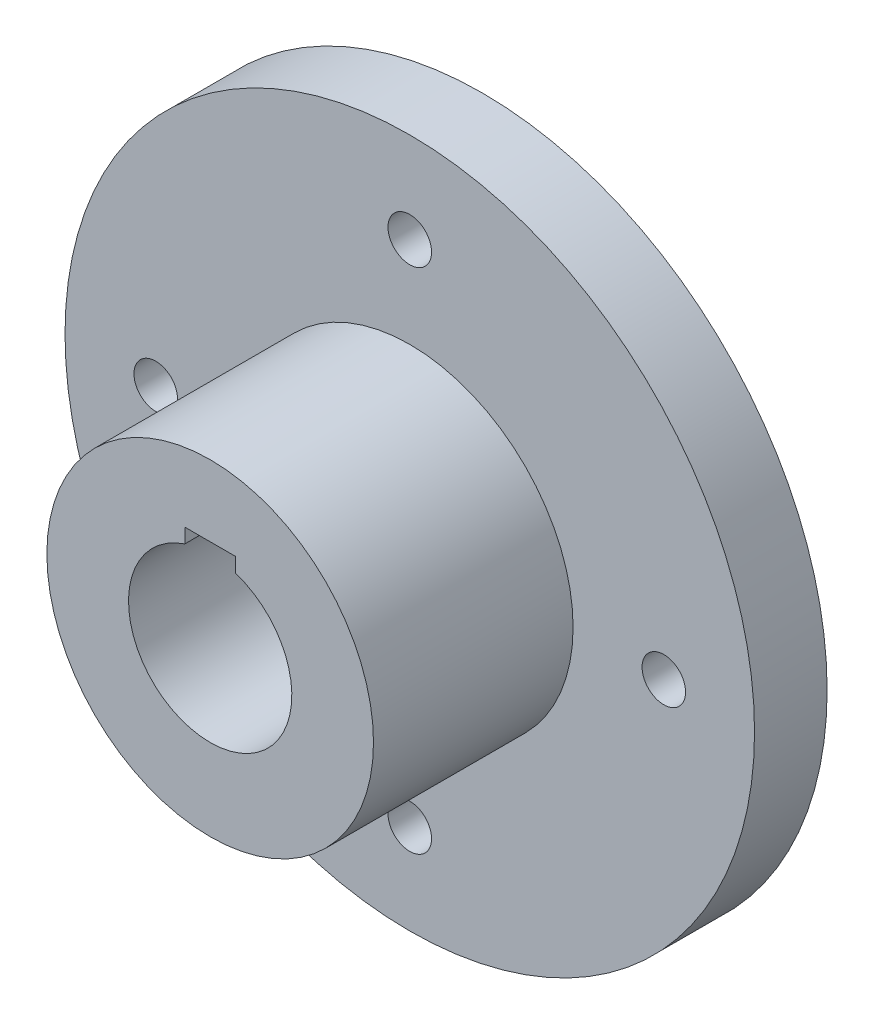
ISO-10303-21;
HEADER;
FILE_DESCRIPTION(('STEP AP214'),'2;1');
FILE_NAME('part.step','',(''),(''),'','','');
FILE_SCHEMA(('AUTOMOTIVE_DESIGN { 1 0 10303 214 1 1 1 1 }'));
ENDSEC;
DATA;
#1=APPLICATION_CONTEXT('core data for automotive mechanical design processes');
#2=APPLICATION_PROTOCOL_DEFINITION('international standard','automotive_design',2000,#1);
#3=PRODUCT_CONTEXT('',#1,'mechanical');
#4=PRODUCT('Part','Part','',(#3));
#5=PRODUCT_RELATED_PRODUCT_CATEGORY('part','',(#4));
#6=PRODUCT_DEFINITION_FORMATION('','',#4);
#7=PRODUCT_DEFINITION_CONTEXT('part definition',#1,'design');
#8=PRODUCT_DEFINITION('design','',#6,#7);
#9=PRODUCT_DEFINITION_SHAPE('','',#8);
#10=(LENGTH_UNIT() NAMED_UNIT(*) SI_UNIT(.MILLI.,.METRE.));
#11=(NAMED_UNIT(*) PLANE_ANGLE_UNIT() SI_UNIT($,.RADIAN.));
#12=(NAMED_UNIT(*) SI_UNIT($,.STERADIAN.) SOLID_ANGLE_UNIT());
#13=UNCERTAINTY_MEASURE_WITH_UNIT(LENGTH_MEASURE(1.E-05),#10,'distance_accuracy_value','');
#14=(GEOMETRIC_REPRESENTATION_CONTEXT(3) GLOBAL_UNCERTAINTY_ASSIGNED_CONTEXT((#13)) GLOBAL_UNIT_ASSIGNED_CONTEXT((#10,
#11,#12)) REPRESENTATION_CONTEXT('',''));
#15=CARTESIAN_POINT('',(0.,0.,0.));
#16=DIRECTION('',(0.,0.,1.));
#17=DIRECTION('',(1.,0.,0.));
#18=AXIS2_PLACEMENT_3D('',#15,#16,#17);
#19=CARTESIAN_POINT('',(0.,0.,20.));
#20=DIRECTION('',(0.,0.,-1.));
#21=DIRECTION('',(-1.,0.,0.));
#22=AXIS2_PLACEMENT_3D('',#19,#20,#21);
#23=CYLINDRICAL_SURFACE('',#22,95.);
#24=CARTESIAN_POINT('',(0.,0.,20.));
#25=DIRECTION('',(0.,0.,1.));
#26=DIRECTION('',(1.,0.,0.));
#27=AXIS2_PLACEMENT_3D('',#24,#25,#26);
#28=CIRCLE('',#27,95.);
#29=CARTESIAN_POINT('',(95.,0.,20.));
#30=VERTEX_POINT('',#29);
#31=EDGE_CURVE('E11',#30,#30,#28,.T.);
#32=ORIENTED_EDGE('',*,*,#31,.F.);
#33=EDGE_LOOP('',(#32));
#34=FACE_BOUND('',#33,.T.);
#35=CARTESIAN_POINT('',(0.,0.,0.));
#36=DIRECTION('',(0.,0.,1.));
#37=DIRECTION('',(1.,0.,0.));
#38=AXIS2_PLACEMENT_3D('',#35,#36,#37);
#39=CIRCLE('',#38,95.);
#40=CARTESIAN_POINT('',(95.,0.,0.));
#41=VERTEX_POINT('',#40);
#42=EDGE_CURVE('E40',#41,#41,#39,.T.);
#43=ORIENTED_EDGE('',*,*,#42,.T.);
#44=EDGE_LOOP('',(#43));
#45=FACE_BOUND('',#44,.T.);
#46=ADVANCED_FACE('F37',(#34,#45),#23,.T.);
#47=CARTESIAN_POINT('',(0.,0.,20.));
#48=DIRECTION('',(0.,0.,1.));
#49=DIRECTION('',(1.,0.,0.));
#50=AXIS2_PLACEMENT_3D('',#47,#48,#49);
#51=PLANE('',#50);
#52=CARTESIAN_POINT('',(0.,0.,20.));
#53=DIRECTION('',(0.,0.,1.));
#54=DIRECTION('',(1.,0.,0.));
#55=AXIS2_PLACEMENT_3D('',#52,#53,#54);
#56=CIRCLE('',#55,45.);
#57=CARTESIAN_POINT('',(45.,0.,20.));
#58=VERTEX_POINT('',#57);
#59=EDGE_CURVE('E112',#58,#58,#56,.T.);
#60=ORIENTED_EDGE('',*,*,#59,.F.);
#61=EDGE_LOOP('',(#60));
#62=FACE_BOUND('',#61,.T.);
#63=CARTESIAN_POINT('',(0.,70.,20.));
#64=DIRECTION('',(0.,0.,-1.));
#65=DIRECTION('',(-1.,0.,0.));
#66=AXIS2_PLACEMENT_3D('',#63,#64,#65);
#67=CIRCLE('',#66,6.);
#68=CARTESIAN_POINT('',(-6.,70.,20.));
#69=VERTEX_POINT('',#68);
#70=EDGE_CURVE('E121',#69,#69,#67,.T.);
#71=ORIENTED_EDGE('',*,*,#70,.T.);
#72=EDGE_LOOP('',(#71));
#73=FACE_BOUND('',#72,.T.);
#74=CARTESIAN_POINT('',(-70.,0.,20.));
#75=DIRECTION('',(0.,0.,-1.));
#76=DIRECTION('',(-1.,0.,0.));
#77=AXIS2_PLACEMENT_3D('',#74,#75,#76);
#78=CIRCLE('',#77,6.);
#79=CARTESIAN_POINT('',(-76.,0.,20.));
#80=VERTEX_POINT('',#79);
#81=EDGE_CURVE('E130',#80,#80,#78,.T.);
#82=ORIENTED_EDGE('',*,*,#81,.T.);
#83=EDGE_LOOP('',(#82));
#84=FACE_BOUND('',#83,.T.);
#85=CARTESIAN_POINT('',(0.,-70.,20.));
#86=DIRECTION('',(0.,0.,-1.));
#87=DIRECTION('',(1.,0.,0.));
#88=AXIS2_PLACEMENT_3D('',#85,#86,#87);
#89=CIRCLE('',#88,6.);
#90=CARTESIAN_POINT('',(6.00000000000001,-70.,20.));
#91=VERTEX_POINT('',#90);
#92=EDGE_CURVE('E136',#91,#91,#89,.T.);
#93=ORIENTED_EDGE('',*,*,#92,.T.);
#94=EDGE_LOOP('',(#93));
#95=FACE_BOUND('',#94,.T.);
#96=CARTESIAN_POINT('',(70.,0.,20.));
#97=DIRECTION('',(0.,0.,-1.));
#98=DIRECTION('',(1.,0.,0.));
#99=AXIS2_PLACEMENT_3D('',#96,#97,#98);
#100=CIRCLE('',#99,6.);
#101=CARTESIAN_POINT('',(76.,0.,20.));
#102=VERTEX_POINT('',#101);
#103=EDGE_CURVE('E118',#102,#102,#100,.T.);
#104=ORIENTED_EDGE('',*,*,#103,.T.);
#105=EDGE_LOOP('',(#104));
#106=FACE_BOUND('',#105,.T.);
#107=ORIENTED_EDGE('',*,*,#31,.T.);
#108=EDGE_LOOP('',(#107));
#109=FACE_BOUND('',#108,.T.);
#110=ADVANCED_FACE('F145',(#62,#73,#84,#95,#106,#109),#51,.T.);
#111=CARTESIAN_POINT('',(0.,0.,0.));
#112=DIRECTION('',(0.,0.,1.));
#113=DIRECTION('',(1.,0.,0.));
#114=AXIS2_PLACEMENT_3D('',#111,#112,#113);
#115=PLANE('',#114);
#116=DIRECTION('',(0.,1.,0.));
#117=VECTOR('',#116,1.);
#118=CARTESIAN_POINT('',(-7.,25.4,0.));
#119=LINE('',#118,#117);
#120=CARTESIAN_POINT('',(-7.,21.3834047803431,0.));
#121=VERTEX_POINT('',#120);
#122=CARTESIAN_POINT('',(-7.,25.4,0.));
#123=VERTEX_POINT('',#122);
#124=EDGE_CURVE('E103',#121,#123,#119,.T.);
#125=ORIENTED_EDGE('',*,*,#124,.F.);
#126=CARTESIAN_POINT('',(0.,0.,0.));
#127=DIRECTION('',(0.,0.,-1.));
#128=DIRECTION('',(-1.,0.,0.));
#129=AXIS2_PLACEMENT_3D('',#126,#127,#128);
#130=CIRCLE('',#129,22.5);
#131=CARTESIAN_POINT('',(7.,21.3834047803431,0.));
#132=VERTEX_POINT('',#131);
#133=EDGE_CURVE('E51',#132,#121,#130,.T.);
#134=ORIENTED_EDGE('',*,*,#133,.F.);
#135=DIRECTION('',(0.,-1.,0.));
#136=VECTOR('',#135,1.);
#137=CARTESIAN_POINT('',(7.,22.5,0.));
#138=LINE('',#137,#136);
#139=CARTESIAN_POINT('',(7.,25.4,0.));
#140=VERTEX_POINT('',#139);
#141=EDGE_CURVE('E107',#140,#132,#138,.T.);
#142=ORIENTED_EDGE('',*,*,#141,.F.);
#143=DIRECTION('',(1.,0.,0.));
#144=VECTOR('',#143,1.);
#145=CARTESIAN_POINT('',(7.,25.4,0.));
#146=LINE('',#145,#144);
#147=EDGE_CURVE('E79',#123,#140,#146,.T.);
#148=ORIENTED_EDGE('',*,*,#147,.F.);
#149=EDGE_LOOP('',(#125,#134,#142,#148));
#150=FACE_BOUND('',#149,.T.);
#151=CARTESIAN_POINT('',(0.,70.,0.));
#152=DIRECTION('',(0.,0.,-1.));
#153=DIRECTION('',(-1.,0.,0.));
#154=AXIS2_PLACEMENT_3D('',#151,#152,#153);
#155=CIRCLE('',#154,6.);
#156=CARTESIAN_POINT('',(-6.,70.,0.));
#157=VERTEX_POINT('',#156);
#158=EDGE_CURVE('E124',#157,#157,#155,.T.);
#159=ORIENTED_EDGE('',*,*,#158,.F.);
#160=EDGE_LOOP('',(#159));
#161=FACE_BOUND('',#160,.T.);
#162=CARTESIAN_POINT('',(-70.,0.,0.));
#163=DIRECTION('',(0.,0.,-1.));
#164=DIRECTION('',(-1.,0.,0.));
#165=AXIS2_PLACEMENT_3D('',#162,#163,#164);
#166=CIRCLE('',#165,6.);
#167=CARTESIAN_POINT('',(-76.,0.,0.));
#168=VERTEX_POINT('',#167);
#169=EDGE_CURVE('E127',#168,#168,#166,.T.);
#170=ORIENTED_EDGE('',*,*,#169,.F.);
#171=EDGE_LOOP('',(#170));
#172=FACE_BOUND('',#171,.T.);
#173=CARTESIAN_POINT('',(0.,-70.,0.));
#174=DIRECTION('',(0.,0.,-1.));
#175=DIRECTION('',(1.,0.,0.));
#176=AXIS2_PLACEMENT_3D('',#173,#174,#175);
#177=CIRCLE('',#176,6.);
#178=CARTESIAN_POINT('',(6.00000000000001,-70.,0.));
#179=VERTEX_POINT('',#178);
#180=EDGE_CURVE('E133',#179,#179,#177,.T.);
#181=ORIENTED_EDGE('',*,*,#180,.F.);
#182=EDGE_LOOP('',(#181));
#183=FACE_BOUND('',#182,.T.);
#184=CARTESIAN_POINT('',(70.,0.,0.));
#185=DIRECTION('',(0.,0.,-1.));
#186=DIRECTION('',(1.,0.,0.));
#187=AXIS2_PLACEMENT_3D('',#184,#185,#186);
#188=CIRCLE('',#187,6.);
#189=CARTESIAN_POINT('',(76.,0.,0.));
#190=VERTEX_POINT('',#189);
#191=EDGE_CURVE('E139',#190,#190,#188,.T.);
#192=ORIENTED_EDGE('',*,*,#191,.F.);
#193=EDGE_LOOP('',(#192));
#194=FACE_BOUND('',#193,.T.);
#195=ORIENTED_EDGE('',*,*,#42,.F.);
#196=EDGE_LOOP('',(#195));
#197=FACE_BOUND('',#196,.T.);
#198=ADVANCED_FACE('F152',(#150,#161,#172,#183,#194,#197),#115,.F.);
#199=CARTESIAN_POINT('',(70.,0.,20.));
#200=DIRECTION('',(0.,0.,-1.));
#201=DIRECTION('',(-1.,0.,0.));
#202=AXIS2_PLACEMENT_3D('',#199,#200,#201);
#203=CYLINDRICAL_SURFACE('',#202,6.);
#204=ORIENTED_EDGE('',*,*,#103,.F.);
#205=EDGE_LOOP('',(#204));
#206=FACE_BOUND('',#205,.T.);
#207=ORIENTED_EDGE('',*,*,#191,.T.);
#208=EDGE_LOOP('',(#207));
#209=FACE_BOUND('',#208,.T.);
#210=ADVANCED_FACE('F148',(#206,#209),#203,.F.);
#211=CARTESIAN_POINT('',(0.,-70.,20.));
#212=DIRECTION('',(0.,0.,-1.));
#213=DIRECTION('',(-1.,0.,0.));
#214=AXIS2_PLACEMENT_3D('',#211,#212,#213);
#215=CYLINDRICAL_SURFACE('',#214,6.);
#216=ORIENTED_EDGE('',*,*,#92,.F.);
#217=EDGE_LOOP('',(#216));
#218=FACE_BOUND('',#217,.T.);
#219=ORIENTED_EDGE('',*,*,#180,.T.);
#220=EDGE_LOOP('',(#219));
#221=FACE_BOUND('',#220,.T.);
#222=ADVANCED_FACE('F151',(#218,#221),#215,.F.);
#223=CARTESIAN_POINT('',(-70.,0.,20.));
#224=DIRECTION('',(0.,0.,-1.));
#225=DIRECTION('',(-1.,0.,0.));
#226=AXIS2_PLACEMENT_3D('',#223,#224,#225);
#227=CYLINDRICAL_SURFACE('',#226,6.);
#228=ORIENTED_EDGE('',*,*,#81,.F.);
#229=EDGE_LOOP('',(#228));
#230=FACE_BOUND('',#229,.T.);
#231=ORIENTED_EDGE('',*,*,#169,.T.);
#232=EDGE_LOOP('',(#231));
#233=FACE_BOUND('',#232,.T.);
#234=ADVANCED_FACE('F177',(#230,#233),#227,.F.);
#235=CARTESIAN_POINT('',(0.,70.,20.));
#236=DIRECTION('',(0.,0.,-1.));
#237=DIRECTION('',(-1.,0.,0.));
#238=AXIS2_PLACEMENT_3D('',#235,#236,#237);
#239=CYLINDRICAL_SURFACE('',#238,6.);
#240=ORIENTED_EDGE('',*,*,#70,.F.);
#241=EDGE_LOOP('',(#240));
#242=FACE_BOUND('',#241,.T.);
#243=ORIENTED_EDGE('',*,*,#158,.T.);
#244=EDGE_LOOP('',(#243));
#245=FACE_BOUND('',#244,.T.);
#246=ADVANCED_FACE('F181',(#242,#245),#239,.F.);
#247=CARTESIAN_POINT('',(0.,0.,75.));
#248=DIRECTION('',(0.,0.,-1.));
#249=DIRECTION('',(-1.,0.,0.));
#250=AXIS2_PLACEMENT_3D('',#247,#248,#249);
#251=CYLINDRICAL_SURFACE('',#250,45.);
#252=CARTESIAN_POINT('',(0.,0.,75.));
#253=DIRECTION('',(0.,0.,1.));
#254=DIRECTION('',(1.,0.,0.));
#255=AXIS2_PLACEMENT_3D('',#252,#253,#254);
#256=CIRCLE('',#255,45.);
#257=CARTESIAN_POINT('',(45.,0.,75.));
#258=VERTEX_POINT('',#257);
#259=EDGE_CURVE('E115',#258,#258,#256,.T.);
#260=ORIENTED_EDGE('',*,*,#259,.F.);
#261=EDGE_LOOP('',(#260));
#262=FACE_BOUND('',#261,.T.);
#263=ORIENTED_EDGE('',*,*,#59,.T.);
#264=EDGE_LOOP('',(#263));
#265=FACE_BOUND('',#264,.T.);
#266=ADVANCED_FACE('F185',(#262,#265),#251,.T.);
#267=CARTESIAN_POINT('',(0.,0.,75.));
#268=DIRECTION('',(0.,0.,1.));
#269=DIRECTION('',(1.,0.,0.));
#270=AXIS2_PLACEMENT_3D('',#267,#268,#269);
#271=PLANE('',#270);
#272=CARTESIAN_POINT('',(0.,0.,75.));
#273=DIRECTION('',(0.,0.,-1.));
#274=DIRECTION('',(-1.,0.,0.));
#275=AXIS2_PLACEMENT_3D('',#272,#273,#274);
#276=CIRCLE('',#275,22.5);
#277=CARTESIAN_POINT('',(7.,21.3834047803431,75.));
#278=VERTEX_POINT('',#277);
#279=CARTESIAN_POINT('',(-7.00000000000001,21.3834047803431,75.));
#280=VERTEX_POINT('',#279);
#281=EDGE_CURVE('E92',#278,#280,#276,.T.);
#282=ORIENTED_EDGE('',*,*,#281,.T.);
#283=DIRECTION('',(0.,1.,0.));
#284=VECTOR('',#283,1.);
#285=CARTESIAN_POINT('',(-7.,22.5,75.));
#286=LINE('',#285,#284);
#287=CARTESIAN_POINT('',(-7.,25.4,75.));
#288=VERTEX_POINT('',#287);
#289=EDGE_CURVE('E98',#280,#288,#286,.T.);
#290=ORIENTED_EDGE('',*,*,#289,.T.);
#291=DIRECTION('',(1.,0.,0.));
#292=VECTOR('',#291,1.);
#293=CARTESIAN_POINT('',(7.,25.4,75.));
#294=LINE('',#293,#292);
#295=CARTESIAN_POINT('',(7.,25.4,75.));
#296=VERTEX_POINT('',#295);
#297=EDGE_CURVE('E59',#288,#296,#294,.T.);
#298=ORIENTED_EDGE('',*,*,#297,.T.);
#299=DIRECTION('',(0.,-1.,0.));
#300=VECTOR('',#299,1.);
#301=CARTESIAN_POINT('',(7.,25.4,75.));
#302=LINE('',#301,#300);
#303=EDGE_CURVE('E87',#296,#278,#302,.T.);
#304=ORIENTED_EDGE('',*,*,#303,.T.);
#305=EDGE_LOOP('',(#282,#290,#298,#304));
#306=FACE_BOUND('',#305,.T.);
#307=ORIENTED_EDGE('',*,*,#259,.T.);
#308=EDGE_LOOP('',(#307));
#309=FACE_BOUND('',#308,.T.);
#310=ADVANCED_FACE('F95',(#306,#309),#271,.T.);
#311=CARTESIAN_POINT('',(0.,0.,75.));
#312=DIRECTION('',(0.,0.,-1.));
#313=DIRECTION('',(-1.,0.,0.));
#314=AXIS2_PLACEMENT_3D('',#311,#312,#313);
#315=CYLINDRICAL_SURFACE('',#314,22.5);
#316=ORIENTED_EDGE('',*,*,#133,.T.);
#317=DIRECTION('',(0.,0.,-1.));
#318=VECTOR('',#317,1.);
#319=CARTESIAN_POINT('',(-7.00000000000001,21.3834047803431,75.));
#320=LINE('',#319,#318);
#321=EDGE_CURVE('E110',#280,#121,#320,.T.);
#322=ORIENTED_EDGE('',*,*,#321,.F.);
#323=ORIENTED_EDGE('',*,*,#281,.F.);
#324=DIRECTION('',(0.,0.,-1.));
#325=VECTOR('',#324,1.);
#326=CARTESIAN_POINT('',(7.,21.3834047803431,75.));
#327=LINE('',#326,#325);
#328=EDGE_CURVE('E83',#278,#132,#327,.T.);
#329=ORIENTED_EDGE('',*,*,#328,.T.);
#330=EDGE_LOOP('',(#316,#322,#323,#329));
#331=FACE_BOUND('',#330,.T.);
#332=ADVANCED_FACE('F192',(#331),#315,.F.);
#333=CARTESIAN_POINT('',(7.,22.5,75.));
#334=DIRECTION('',(1.,0.,0.));
#335=DIRECTION('',(0.,0.,-1.));
#336=AXIS2_PLACEMENT_3D('',#333,#334,#335);
#337=PLANE('',#336);
#338=ORIENTED_EDGE('',*,*,#141,.T.);
#339=ORIENTED_EDGE('',*,*,#328,.F.);
#340=ORIENTED_EDGE('',*,*,#303,.F.);
#341=DIRECTION('',(0.,0.,-1.));
#342=VECTOR('',#341,1.);
#343=CARTESIAN_POINT('',(7.,25.4,75.));
#344=LINE('',#343,#342);
#345=EDGE_CURVE('E75',#296,#140,#344,.T.);
#346=ORIENTED_EDGE('',*,*,#345,.T.);
#347=EDGE_LOOP('',(#338,#339,#340,#346));
#348=FACE_BOUND('',#347,.T.);
#349=ADVANCED_FACE('F88',(#348),#337,.F.);
#350=CARTESIAN_POINT('',(7.,25.4,75.));
#351=DIRECTION('',(0.,1.,0.));
#352=DIRECTION('',(-1.,0.,0.));
#353=AXIS2_PLACEMENT_3D('',#350,#351,#352);
#354=PLANE('',#353);
#355=ORIENTED_EDGE('',*,*,#147,.T.);
#356=ORIENTED_EDGE('',*,*,#345,.F.);
#357=ORIENTED_EDGE('',*,*,#297,.F.);
#358=DIRECTION('',(0.,0.,-1.));
#359=VECTOR('',#358,1.);
#360=CARTESIAN_POINT('',(-7.,25.4,75.));
#361=LINE('',#360,#359);
#362=EDGE_CURVE('E84',#288,#123,#361,.T.);
#363=ORIENTED_EDGE('',*,*,#362,.T.);
#364=EDGE_LOOP('',(#355,#356,#357,#363));
#365=FACE_BOUND('',#364,.T.);
#366=ADVANCED_FACE('F77',(#365),#354,.F.);
#367=CARTESIAN_POINT('',(-7.,25.4,75.));
#368=DIRECTION('',(-1.,0.,0.));
#369=DIRECTION('',(0.,0.,1.));
#370=AXIS2_PLACEMENT_3D('',#367,#368,#369);
#371=PLANE('',#370);
#372=ORIENTED_EDGE('',*,*,#124,.T.);
#373=ORIENTED_EDGE('',*,*,#362,.F.);
#374=ORIENTED_EDGE('',*,*,#289,.F.);
#375=ORIENTED_EDGE('',*,*,#321,.T.);
#376=EDGE_LOOP('',(#372,#373,#374,#375));
#377=FACE_BOUND('',#376,.T.);
#378=ADVANCED_FACE('F193',(#377),#371,.F.);
#379=CLOSED_SHELL('',(#46,#110,#198,#210,#222,#234,#246,#266,#310,#332,#349,#366,#378));
#380=MANIFOLD_SOLID_BREP('B2',#379);
#381=ADVANCED_BREP_SHAPE_REPRESENTATION('',(#18,#380),#14);
#382=SHAPE_DEFINITION_REPRESENTATION(#9,#381);
ENDSEC;
END-ISO-10303-21;
